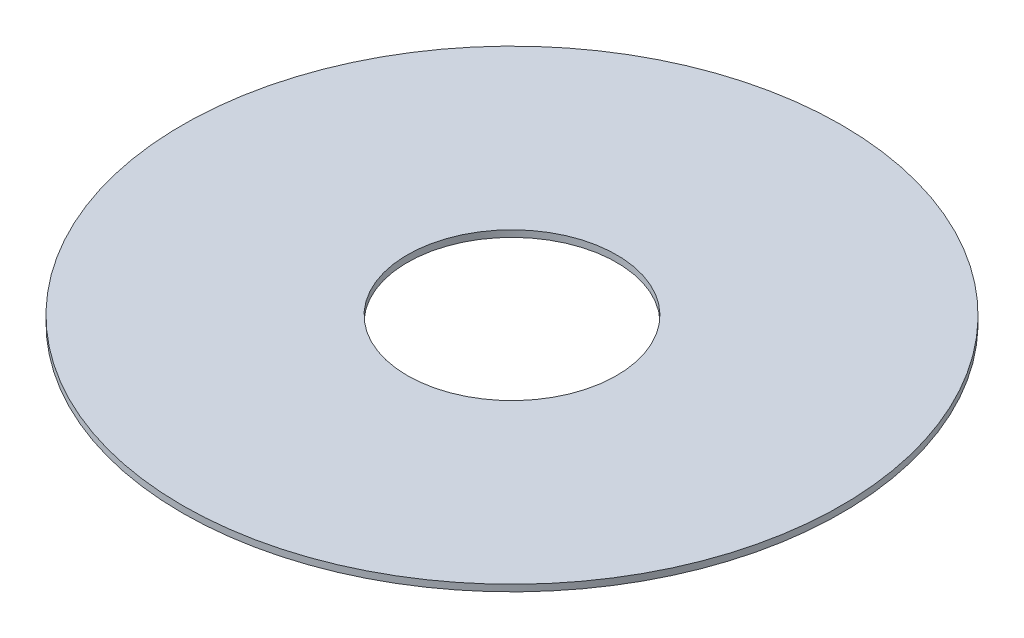
ISO-10303-21;
HEADER;
FILE_DESCRIPTION(('STEP AP214'),'2;1');
FILE_NAME('part.step','',(''),(''),'','','');
FILE_SCHEMA(('AUTOMOTIVE_DESIGN { 1 0 10303 214 1 1 1 1 }'));
ENDSEC;
DATA;
#1=APPLICATION_CONTEXT('core data for automotive mechanical design processes');
#2=APPLICATION_PROTOCOL_DEFINITION('international standard','automotive_design',2000,#1);
#3=PRODUCT_CONTEXT('',#1,'mechanical');
#4=PRODUCT('Part','Part','',(#3));
#5=PRODUCT_RELATED_PRODUCT_CATEGORY('part','',(#4));
#6=PRODUCT_DEFINITION_FORMATION('','',#4);
#7=PRODUCT_DEFINITION_CONTEXT('part definition',#1,'design');
#8=PRODUCT_DEFINITION('design','',#6,#7);
#9=PRODUCT_DEFINITION_SHAPE('','',#8);
#10=(LENGTH_UNIT() NAMED_UNIT(*) SI_UNIT(.MILLI.,.METRE.));
#11=(NAMED_UNIT(*) PLANE_ANGLE_UNIT() SI_UNIT($,.RADIAN.));
#12=(NAMED_UNIT(*) SI_UNIT($,.STERADIAN.) SOLID_ANGLE_UNIT());
#13=UNCERTAINTY_MEASURE_WITH_UNIT(LENGTH_MEASURE(1.E-05),#10,'distance_accuracy_value','');
#14=(GEOMETRIC_REPRESENTATION_CONTEXT(3) GLOBAL_UNCERTAINTY_ASSIGNED_CONTEXT((#13)) GLOBAL_UNIT_ASSIGNED_CONTEXT((#10,
#11,#12)) REPRESENTATION_CONTEXT('',''));
#15=CARTESIAN_POINT('',(0.,0.,0.));
#16=DIRECTION('',(0.,0.,1.));
#17=DIRECTION('',(1.,0.,0.));
#18=AXIS2_PLACEMENT_3D('',#15,#16,#17);
#19=CARTESIAN_POINT('',(0.,2.,0.));
#20=DIRECTION('',(0.,1.,0.));
#21=DIRECTION('',(0.,0.,1.));
#22=AXIS2_PLACEMENT_3D('',#19,#20,#21);
#23=PLANE('',#22);
#24=CARTESIAN_POINT('',(0.,2.,0.));
#25=DIRECTION('',(0.,1.,0.));
#26=DIRECTION('',(0.,0.,1.));
#27=AXIS2_PLACEMENT_3D('',#24,#25,#26);
#28=CIRCLE('',#27,100.);
#29=CARTESIAN_POINT('',(0.,2.,100.));
#30=VERTEX_POINT('',#29);
#31=EDGE_CURVE('E10',#30,#30,#28,.T.);
#32=ORIENTED_EDGE('',*,*,#31,.T.);
#33=EDGE_LOOP('',(#32));
#34=FACE_BOUND('',#33,.T.);
#35=CARTESIAN_POINT('',(0.,2.,0.));
#36=DIRECTION('',(0.,1.,0.));
#37=DIRECTION('',(0.,0.,1.));
#38=AXIS2_PLACEMENT_3D('',#35,#36,#37);
#39=CIRCLE('',#38,31.75);
#40=CARTESIAN_POINT('',(0.,2.,31.75));
#41=VERTEX_POINT('',#40);
#42=EDGE_CURVE('E42',#41,#41,#39,.T.);
#43=ORIENTED_EDGE('',*,*,#42,.F.);
#44=EDGE_LOOP('',(#43));
#45=FACE_BOUND('',#44,.T.);
#46=ADVANCED_FACE('F31',(#34,#45),#23,.T.);
#47=CARTESIAN_POINT('',(0.,0.,0.));
#48=DIRECTION('',(0.,1.,0.));
#49=DIRECTION('',(0.,0.,1.));
#50=AXIS2_PLACEMENT_3D('',#47,#48,#49);
#51=PLANE('',#50);
#52=CARTESIAN_POINT('',(0.,0.,0.));
#53=DIRECTION('',(0.,1.,0.));
#54=DIRECTION('',(0.,0.,1.));
#55=AXIS2_PLACEMENT_3D('',#52,#53,#54);
#56=CIRCLE('',#55,100.);
#57=CARTESIAN_POINT('',(0.,0.,100.));
#58=VERTEX_POINT('',#57);
#59=EDGE_CURVE('E35',#58,#58,#56,.T.);
#60=ORIENTED_EDGE('',*,*,#59,.F.);
#61=EDGE_LOOP('',(#60));
#62=FACE_BOUND('',#61,.T.);
#63=CARTESIAN_POINT('',(0.,0.,0.));
#64=DIRECTION('',(0.,1.,0.));
#65=DIRECTION('',(0.,0.,1.));
#66=AXIS2_PLACEMENT_3D('',#63,#64,#65);
#67=CIRCLE('',#66,31.75);
#68=CARTESIAN_POINT('',(0.,0.,31.75));
#69=VERTEX_POINT('',#68);
#70=EDGE_CURVE('E44',#69,#69,#67,.T.);
#71=ORIENTED_EDGE('',*,*,#70,.T.);
#72=EDGE_LOOP('',(#71));
#73=FACE_BOUND('',#72,.T.);
#74=ADVANCED_FACE('F54',(#62,#73),#51,.F.);
#75=CARTESIAN_POINT('',(0.,2.,0.));
#76=DIRECTION('',(0.,-1.,0.));
#77=DIRECTION('',(0.,0.,-1.));
#78=AXIS2_PLACEMENT_3D('',#75,#76,#77);
#79=CYLINDRICAL_SURFACE('',#78,100.);
#80=ORIENTED_EDGE('',*,*,#31,.F.);
#81=EDGE_LOOP('',(#80));
#82=FACE_BOUND('',#81,.T.);
#83=ORIENTED_EDGE('',*,*,#59,.T.);
#84=EDGE_LOOP('',(#83));
#85=FACE_BOUND('',#84,.T.);
#86=ADVANCED_FACE('F33',(#82,#85),#79,.T.);
#87=CARTESIAN_POINT('',(0.,2.,0.));
#88=DIRECTION('',(0.,-1.,0.));
#89=DIRECTION('',(0.,0.,-1.));
#90=AXIS2_PLACEMENT_3D('',#87,#88,#89);
#91=CYLINDRICAL_SURFACE('',#90,31.75);
#92=ORIENTED_EDGE('',*,*,#42,.T.);
#93=EDGE_LOOP('',(#92));
#94=FACE_BOUND('',#93,.T.);
#95=ORIENTED_EDGE('',*,*,#70,.F.);
#96=EDGE_LOOP('',(#95));
#97=FACE_BOUND('',#96,.T.);
#98=ADVANCED_FACE('F50',(#94,#97),#91,.F.);
#99=CLOSED_SHELL('',(#46,#74,#86,#98));
#100=MANIFOLD_SOLID_BREP('B2',#99);
#101=ADVANCED_BREP_SHAPE_REPRESENTATION('',(#18,#100),#14);
#102=SHAPE_DEFINITION_REPRESENTATION(#9,#101);
ENDSEC;
END-ISO-10303-21;
